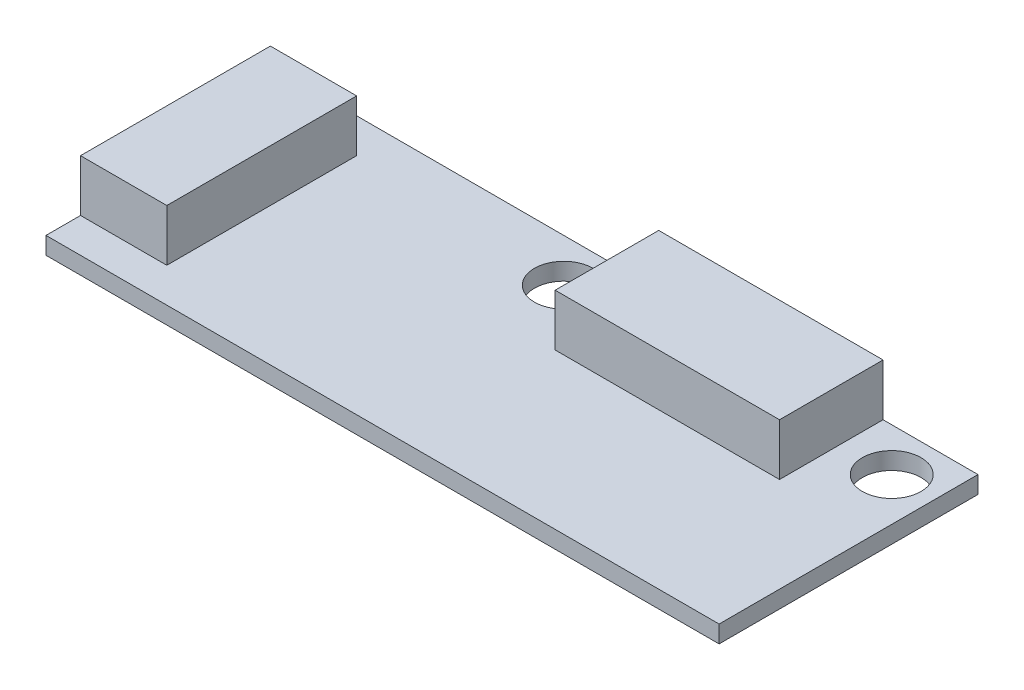
ISO-10303-21;
HEADER;
FILE_DESCRIPTION(('STEP AP214'),'2;1');
FILE_NAME('part.step','',(''),(''),'','','');
FILE_SCHEMA(('AUTOMOTIVE_DESIGN { 1 0 10303 214 1 1 1 1 }'));
ENDSEC;
DATA;
#1=APPLICATION_CONTEXT('core data for automotive mechanical design processes');
#2=APPLICATION_PROTOCOL_DEFINITION('international standard','automotive_design',2000,#1);
#3=PRODUCT_CONTEXT('',#1,'mechanical');
#4=PRODUCT('Part','Part','',(#3));
#5=PRODUCT_RELATED_PRODUCT_CATEGORY('part','',(#4));
#6=PRODUCT_DEFINITION_FORMATION('','',#4);
#7=PRODUCT_DEFINITION_CONTEXT('part definition',#1,'design');
#8=PRODUCT_DEFINITION('design','',#6,#7);
#9=PRODUCT_DEFINITION_SHAPE('','',#8);
#10=(LENGTH_UNIT() NAMED_UNIT(*) SI_UNIT(.MILLI.,.METRE.));
#11=(NAMED_UNIT(*) PLANE_ANGLE_UNIT() SI_UNIT($,.RADIAN.));
#12=(NAMED_UNIT(*) SI_UNIT($,.STERADIAN.) SOLID_ANGLE_UNIT());
#13=UNCERTAINTY_MEASURE_WITH_UNIT(LENGTH_MEASURE(1.E-05),#10,'distance_accuracy_value','');
#14=(GEOMETRIC_REPRESENTATION_CONTEXT(3) GLOBAL_UNCERTAINTY_ASSIGNED_CONTEXT((#13)) GLOBAL_UNIT_ASSIGNED_CONTEXT((#10,
#11,#12)) REPRESENTATION_CONTEXT('',''));
#15=CARTESIAN_POINT('',(0.,0.,0.));
#16=DIRECTION('',(0.,0.,1.));
#17=DIRECTION('',(1.,0.,0.));
#18=AXIS2_PLACEMENT_3D('',#15,#16,#17);
#19=CARTESIAN_POINT('',(0.,1.,0.));
#20=DIRECTION('',(0.,-1.,0.));
#21=DIRECTION('',(0.,0.,-1.));
#22=AXIS2_PLACEMENT_3D('',#19,#20,#21);
#23=PLANE('',#22);
#24=CARTESIAN_POINT('',(36.5,1.,-12.5));
#25=DIRECTION('',(0.,1.,0.));
#26=DIRECTION('',(0.,0.,1.));
#27=AXIS2_PLACEMENT_3D('',#24,#25,#26);
#28=CIRCLE('',#27,1.69999999999999);
#29=CARTESIAN_POINT('',(36.5,1.,-10.8));
#30=VERTEX_POINT('',#29);
#31=EDGE_CURVE('E179',#30,#30,#28,.T.);
#32=ORIENTED_EDGE('',*,*,#31,.F.);
#33=EDGE_LOOP('',(#32));
#34=FACE_BOUND('',#33,.T.);
#35=CARTESIAN_POINT('',(17.5,1.,-12.5));
#36=DIRECTION('',(0.,1.,0.));
#37=DIRECTION('',(0.,0.,1.));
#38=AXIS2_PLACEMENT_3D('',#35,#36,#37);
#39=CIRCLE('',#38,1.69999999999999);
#40=CARTESIAN_POINT('',(17.5,1.,-10.8));
#41=VERTEX_POINT('',#40);
#42=EDGE_CURVE('E185',#41,#41,#39,.T.);
#43=ORIENTED_EDGE('',*,*,#42,.F.);
#44=EDGE_LOOP('',(#43));
#45=FACE_BOUND('',#44,.T.);
#46=DIRECTION('',(1.,0.,0.));
#47=VECTOR('',#46,1.);
#48=CARTESIAN_POINT('',(0.,1.,-2.));
#49=LINE('',#48,#47);
#50=CARTESIAN_POINT('',(0.,1.,-2.));
#51=VERTEX_POINT('',#50);
#52=CARTESIAN_POINT('',(5.,1.,-2.));
#53=VERTEX_POINT('',#52);
#54=EDGE_CURVE('E238',#51,#53,#49,.T.);
#55=ORIENTED_EDGE('',*,*,#54,.F.);
#56=DIRECTION('',(0.,0.,1.));
#57=VECTOR('',#56,1.);
#58=CARTESIAN_POINT('',(0.,1.,0.));
#59=LINE('',#58,#57);
#60=CARTESIAN_POINT('',(0.,1.,0.));
#61=VERTEX_POINT('',#60);
#62=EDGE_CURVE('E143',#51,#61,#59,.T.);
#63=ORIENTED_EDGE('',*,*,#62,.T.);
#64=DIRECTION('',(1.,0.,0.));
#65=VECTOR('',#64,1.);
#66=CARTESIAN_POINT('',(0.,1.,0.));
#67=LINE('',#66,#65);
#68=CARTESIAN_POINT('',(39.,1.,0.));
#69=VERTEX_POINT('',#68);
#70=EDGE_CURVE('E194',#61,#69,#67,.T.);
#71=ORIENTED_EDGE('',*,*,#70,.T.);
#72=DIRECTION('',(0.,0.,-1.));
#73=VECTOR('',#72,1.);
#74=CARTESIAN_POINT('',(39.,1.,0.));
#75=LINE('',#74,#73);
#76=CARTESIAN_POINT('',(39.,1.,-15.));
#77=VERTEX_POINT('',#76);
#78=EDGE_CURVE('E196',#69,#77,#75,.T.);
#79=ORIENTED_EDGE('',*,*,#78,.T.);
#80=DIRECTION('',(-1.,0.,0.));
#81=VECTOR('',#80,1.);
#82=CARTESIAN_POINT('',(0.,1.,-15.));
#83=LINE('',#82,#81);
#84=CARTESIAN_POINT('',(33.5,1.,-15.));
#85=VERTEX_POINT('',#84);
#86=EDGE_CURVE('E199',#77,#85,#83,.T.);
#87=ORIENTED_EDGE('',*,*,#86,.T.);
#88=DIRECTION('',(0.,0.,-1.));
#89=VECTOR('',#88,1.);
#90=CARTESIAN_POINT('',(33.5,1.,-15.));
#91=LINE('',#90,#89);
#92=CARTESIAN_POINT('',(33.5,1.,-9.));
#93=VERTEX_POINT('',#92);
#94=EDGE_CURVE('E157',#93,#85,#91,.T.);
#95=ORIENTED_EDGE('',*,*,#94,.F.);
#96=DIRECTION('',(1.,0.,0.));
#97=VECTOR('',#96,1.);
#98=CARTESIAN_POINT('',(20.5,1.,-9.));
#99=LINE('',#98,#97);
#100=CARTESIAN_POINT('',(20.5,1.,-9.));
#101=VERTEX_POINT('',#100);
#102=EDGE_CURVE('E147',#101,#93,#99,.T.);
#103=ORIENTED_EDGE('',*,*,#102,.F.);
#104=DIRECTION('',(0.,0.,1.));
#105=VECTOR('',#104,1.);
#106=CARTESIAN_POINT('',(20.5,1.,-15.));
#107=LINE('',#106,#105);
#108=CARTESIAN_POINT('',(20.5,1.,-15.));
#109=VERTEX_POINT('',#108);
#110=EDGE_CURVE('E144',#109,#101,#107,.T.);
#111=ORIENTED_EDGE('',*,*,#110,.F.);
#112=CARTESIAN_POINT('',(0.,1.,-15.));
#113=VERTEX_POINT('',#112);
#114=EDGE_CURVE('E198',#109,#113,#83,.T.);
#115=ORIENTED_EDGE('',*,*,#114,.T.);
#116=CARTESIAN_POINT('',(0.,1.,-13.));
#117=VERTEX_POINT('',#116);
#118=EDGE_CURVE('E192',#113,#117,#59,.T.);
#119=ORIENTED_EDGE('',*,*,#118,.T.);
#120=DIRECTION('',(-1.,0.,0.));
#121=VECTOR('',#120,1.);
#122=CARTESIAN_POINT('',(0.,1.,-13.));
#123=LINE('',#122,#121);
#124=CARTESIAN_POINT('',(5.,1.,-13.));
#125=VERTEX_POINT('',#124);
#126=EDGE_CURVE('E53',#125,#117,#123,.T.);
#127=ORIENTED_EDGE('',*,*,#126,.F.);
#128=DIRECTION('',(0.,0.,-1.));
#129=VECTOR('',#128,1.);
#130=CARTESIAN_POINT('',(5.,1.,-13.));
#131=LINE('',#130,#129);
#132=EDGE_CURVE('E48',#53,#125,#131,.T.);
#133=ORIENTED_EDGE('',*,*,#132,.F.);
#134=EDGE_LOOP('',(#55,#63,#71,#79,#87,#95,#103,#111,#115,#119,#127,#133));
#135=FACE_BOUND('',#134,.T.);
#136=ADVANCED_FACE('F33',(#34,#45,#135),#23,.F.);
#137=CARTESIAN_POINT('',(0.,1.,0.));
#138=DIRECTION('',(1.,0.,0.));
#139=DIRECTION('',(0.,0.,-1.));
#140=AXIS2_PLACEMENT_3D('',#137,#138,#139);
#141=PLANE('',#140);
#142=DIRECTION('',(0.,0.,1.));
#143=VECTOR('',#142,1.);
#144=CARTESIAN_POINT('',(0.,0.,0.));
#145=LINE('',#144,#143);
#146=CARTESIAN_POINT('',(0.,0.,-15.));
#147=VERTEX_POINT('',#146);
#148=CARTESIAN_POINT('',(0.,0.,0.));
#149=VERTEX_POINT('',#148);
#150=EDGE_CURVE('E191',#147,#149,#145,.T.);
#151=ORIENTED_EDGE('',*,*,#150,.T.);
#152=DIRECTION('',(0.,-1.,0.));
#153=VECTOR('',#152,1.);
#154=CARTESIAN_POINT('',(0.,1.,0.));
#155=LINE('',#154,#153);
#156=EDGE_CURVE('E11',#61,#149,#155,.T.);
#157=ORIENTED_EDGE('',*,*,#156,.F.);
#158=ORIENTED_EDGE('',*,*,#62,.F.);
#159=DIRECTION('',(0.,-1.,0.));
#160=VECTOR('',#159,1.);
#161=CARTESIAN_POINT('',(0.,4.,-2.));
#162=LINE('',#161,#160);
#163=CARTESIAN_POINT('',(0.,4.,-2.));
#164=VERTEX_POINT('',#163);
#165=EDGE_CURVE('E125',#164,#51,#162,.T.);
#166=ORIENTED_EDGE('',*,*,#165,.F.);
#167=DIRECTION('',(0.,0.,1.));
#168=VECTOR('',#167,1.);
#169=CARTESIAN_POINT('',(0.,4.,-13.));
#170=LINE('',#169,#168);
#171=CARTESIAN_POINT('',(0.,4.,-13.));
#172=VERTEX_POINT('',#171);
#173=EDGE_CURVE('E131',#172,#164,#170,.T.);
#174=ORIENTED_EDGE('',*,*,#173,.F.);
#175=DIRECTION('',(0.,-1.,0.));
#176=VECTOR('',#175,1.);
#177=CARTESIAN_POINT('',(0.,4.,-13.));
#178=LINE('',#177,#176);
#179=EDGE_CURVE('E232',#172,#117,#178,.T.);
#180=ORIENTED_EDGE('',*,*,#179,.T.);
#181=ORIENTED_EDGE('',*,*,#118,.F.);
#182=DIRECTION('',(0.,-1.,0.));
#183=VECTOR('',#182,1.);
#184=CARTESIAN_POINT('',(0.,1.,-15.));
#185=LINE('',#184,#183);
#186=EDGE_CURVE('E201',#113,#147,#185,.T.);
#187=ORIENTED_EDGE('',*,*,#186,.T.);
#188=EDGE_LOOP('',(#151,#157,#158,#166,#174,#180,#181,#187));
#189=FACE_BOUND('',#188,.T.);
#190=ADVANCED_FACE('F35',(#189),#141,.F.);
#191=CARTESIAN_POINT('',(0.,1.,0.));
#192=DIRECTION('',(0.,0.,-1.));
#193=DIRECTION('',(-1.,0.,0.));
#194=AXIS2_PLACEMENT_3D('',#191,#192,#193);
#195=PLANE('',#194);
#196=DIRECTION('',(1.,0.,0.));
#197=VECTOR('',#196,1.);
#198=CARTESIAN_POINT('',(0.,0.,0.));
#199=LINE('',#198,#197);
#200=CARTESIAN_POINT('',(39.,0.,0.));
#201=VERTEX_POINT('',#200);
#202=EDGE_CURVE('E203',#149,#201,#199,.T.);
#203=ORIENTED_EDGE('',*,*,#202,.T.);
#204=DIRECTION('',(0.,-1.,0.));
#205=VECTOR('',#204,1.);
#206=CARTESIAN_POINT('',(39.,1.,0.));
#207=LINE('',#206,#205);
#208=EDGE_CURVE('E41',#69,#201,#207,.T.);
#209=ORIENTED_EDGE('',*,*,#208,.F.);
#210=ORIENTED_EDGE('',*,*,#70,.F.);
#211=ORIENTED_EDGE('',*,*,#156,.T.);
#212=EDGE_LOOP('',(#203,#209,#210,#211));
#213=FACE_BOUND('',#212,.T.);
#214=ADVANCED_FACE('F261',(#213),#195,.F.);
#215=CARTESIAN_POINT('',(39.,1.,0.));
#216=DIRECTION('',(-1.,0.,0.));
#217=DIRECTION('',(0.,0.,1.));
#218=AXIS2_PLACEMENT_3D('',#215,#216,#217);
#219=PLANE('',#218);
#220=DIRECTION('',(0.,0.,-1.));
#221=VECTOR('',#220,1.);
#222=CARTESIAN_POINT('',(39.,0.,0.));
#223=LINE('',#222,#221);
#224=CARTESIAN_POINT('',(39.,0.,-15.));
#225=VERTEX_POINT('',#224);
#226=EDGE_CURVE('E205',#201,#225,#223,.T.);
#227=ORIENTED_EDGE('',*,*,#226,.T.);
#228=DIRECTION('',(0.,-1.,0.));
#229=VECTOR('',#228,1.);
#230=CARTESIAN_POINT('',(39.,1.,-15.));
#231=LINE('',#230,#229);
#232=EDGE_CURVE('E211',#77,#225,#231,.T.);
#233=ORIENTED_EDGE('',*,*,#232,.F.);
#234=ORIENTED_EDGE('',*,*,#78,.F.);
#235=ORIENTED_EDGE('',*,*,#208,.T.);
#236=EDGE_LOOP('',(#227,#233,#234,#235));
#237=FACE_BOUND('',#236,.T.);
#238=ADVANCED_FACE('F218',(#237),#219,.F.);
#239=CARTESIAN_POINT('',(0.,1.,-15.));
#240=DIRECTION('',(0.,0.,1.));
#241=DIRECTION('',(1.,0.,0.));
#242=AXIS2_PLACEMENT_3D('',#239,#240,#241);
#243=PLANE('',#242);
#244=DIRECTION('',(-1.,0.,0.));
#245=VECTOR('',#244,1.);
#246=CARTESIAN_POINT('',(0.,0.,-15.));
#247=LINE('',#246,#245);
#248=EDGE_CURVE('E207',#225,#147,#247,.T.);
#249=ORIENTED_EDGE('',*,*,#248,.T.);
#250=ORIENTED_EDGE('',*,*,#186,.F.);
#251=ORIENTED_EDGE('',*,*,#114,.F.);
#252=DIRECTION('',(0.,-1.,0.));
#253=VECTOR('',#252,1.);
#254=CARTESIAN_POINT('',(20.5,4.,-15.));
#255=LINE('',#254,#253);
#256=CARTESIAN_POINT('',(20.5,4.,-15.));
#257=VERTEX_POINT('',#256);
#258=EDGE_CURVE('E162',#257,#109,#255,.T.);
#259=ORIENTED_EDGE('',*,*,#258,.F.);
#260=DIRECTION('',(-1.,0.,0.));
#261=VECTOR('',#260,1.);
#262=CARTESIAN_POINT('',(20.5,4.,-15.));
#263=LINE('',#262,#261);
#264=CARTESIAN_POINT('',(33.5,4.,-15.));
#265=VERTEX_POINT('',#264);
#266=EDGE_CURVE('E161',#265,#257,#263,.T.);
#267=ORIENTED_EDGE('',*,*,#266,.F.);
#268=DIRECTION('',(0.,-1.,0.));
#269=VECTOR('',#268,1.);
#270=CARTESIAN_POINT('',(33.5,4.,-15.));
#271=LINE('',#270,#269);
#272=EDGE_CURVE('E170',#265,#85,#271,.T.);
#273=ORIENTED_EDGE('',*,*,#272,.T.);
#274=ORIENTED_EDGE('',*,*,#86,.F.);
#275=ORIENTED_EDGE('',*,*,#232,.T.);
#276=EDGE_LOOP('',(#249,#250,#251,#259,#267,#273,#274,#275));
#277=FACE_BOUND('',#276,.T.);
#278=ADVANCED_FACE('F228',(#277),#243,.F.);
#279=CARTESIAN_POINT('',(0.,0.,0.));
#280=DIRECTION('',(0.,-1.,0.));
#281=DIRECTION('',(0.,0.,-1.));
#282=AXIS2_PLACEMENT_3D('',#279,#280,#281);
#283=PLANE('',#282);
#284=CARTESIAN_POINT('',(36.5,0.,-12.5));
#285=DIRECTION('',(0.,1.,0.));
#286=DIRECTION('',(0.,0.,1.));
#287=AXIS2_PLACEMENT_3D('',#284,#285,#286);
#288=CIRCLE('',#287,1.7);
#289=CARTESIAN_POINT('',(36.5,0.,-10.8));
#290=VERTEX_POINT('',#289);
#291=EDGE_CURVE('E182',#290,#290,#288,.T.);
#292=ORIENTED_EDGE('',*,*,#291,.T.);
#293=EDGE_LOOP('',(#292));
#294=FACE_BOUND('',#293,.T.);
#295=CARTESIAN_POINT('',(17.5,0.,-12.5));
#296=DIRECTION('',(0.,1.,0.));
#297=DIRECTION('',(0.,0.,1.));
#298=AXIS2_PLACEMENT_3D('',#295,#296,#297);
#299=CIRCLE('',#298,1.7);
#300=CARTESIAN_POINT('',(17.5,0.,-10.8));
#301=VERTEX_POINT('',#300);
#302=EDGE_CURVE('E188',#301,#301,#299,.T.);
#303=ORIENTED_EDGE('',*,*,#302,.T.);
#304=EDGE_LOOP('',(#303));
#305=FACE_BOUND('',#304,.T.);
#306=ORIENTED_EDGE('',*,*,#150,.F.);
#307=ORIENTED_EDGE('',*,*,#248,.F.);
#308=ORIENTED_EDGE('',*,*,#226,.F.);
#309=ORIENTED_EDGE('',*,*,#202,.F.);
#310=EDGE_LOOP('',(#306,#307,#308,#309));
#311=FACE_BOUND('',#310,.T.);
#312=ADVANCED_FACE('F225',(#294,#305,#311),#283,.T.);
#313=CARTESIAN_POINT('',(17.5,1.,-12.5));
#314=DIRECTION('',(0.,1.,0.));
#315=DIRECTION('',(0.,0.,1.));
#316=AXIS2_PLACEMENT_3D('',#313,#314,#315);
#317=CYLINDRICAL_SURFACE('',#316,1.69999999999999);
#318=ORIENTED_EDGE('',*,*,#302,.F.);
#319=EDGE_LOOP('',(#318));
#320=FACE_BOUND('',#319,.T.);
#321=ORIENTED_EDGE('',*,*,#42,.T.);
#322=EDGE_LOOP('',(#321));
#323=FACE_BOUND('',#322,.T.);
#324=ADVANCED_FACE('F266',(#320,#323),#317,.F.);
#325=CARTESIAN_POINT('',(36.5,1.,-12.5));
#326=DIRECTION('',(0.,1.,0.));
#327=DIRECTION('',(0.,0.,1.));
#328=AXIS2_PLACEMENT_3D('',#325,#326,#327);
#329=CYLINDRICAL_SURFACE('',#328,1.69999999999999);
#330=ORIENTED_EDGE('',*,*,#291,.F.);
#331=EDGE_LOOP('',(#330));
#332=FACE_BOUND('',#331,.T.);
#333=ORIENTED_EDGE('',*,*,#31,.T.);
#334=EDGE_LOOP('',(#333));
#335=FACE_BOUND('',#334,.T.);
#336=ADVANCED_FACE('F301',(#332,#335),#329,.F.);
#337=CARTESIAN_POINT('',(20.5,4.,-15.));
#338=DIRECTION('',(1.,0.,0.));
#339=DIRECTION('',(0.,0.,-1.));
#340=AXIS2_PLACEMENT_3D('',#337,#338,#339);
#341=PLANE('',#340);
#342=ORIENTED_EDGE('',*,*,#110,.T.);
#343=DIRECTION('',(0.,-1.,0.));
#344=VECTOR('',#343,1.);
#345=CARTESIAN_POINT('',(20.5,4.,-9.));
#346=LINE('',#345,#344);
#347=CARTESIAN_POINT('',(20.5,4.,-9.));
#348=VERTEX_POINT('',#347);
#349=EDGE_CURVE('E176',#348,#101,#346,.T.);
#350=ORIENTED_EDGE('',*,*,#349,.F.);
#351=DIRECTION('',(0.,0.,1.));
#352=VECTOR('',#351,1.);
#353=CARTESIAN_POINT('',(20.5,4.,-15.));
#354=LINE('',#353,#352);
#355=EDGE_CURVE('E153',#257,#348,#354,.T.);
#356=ORIENTED_EDGE('',*,*,#355,.F.);
#357=ORIENTED_EDGE('',*,*,#258,.T.);
#358=EDGE_LOOP('',(#342,#350,#356,#357));
#359=FACE_BOUND('',#358,.T.);
#360=ADVANCED_FACE('F289',(#359),#341,.F.);
#361=CARTESIAN_POINT('',(20.5,4.,-9.));
#362=DIRECTION('',(0.,0.,-1.));
#363=DIRECTION('',(-1.,0.,0.));
#364=AXIS2_PLACEMENT_3D('',#361,#362,#363);
#365=PLANE('',#364);
#366=ORIENTED_EDGE('',*,*,#102,.T.);
#367=DIRECTION('',(0.,-1.,0.));
#368=VECTOR('',#367,1.);
#369=CARTESIAN_POINT('',(33.5,4.,-9.));
#370=LINE('',#369,#368);
#371=CARTESIAN_POINT('',(33.5,4.,-9.));
#372=VERTEX_POINT('',#371);
#373=EDGE_CURVE('E173',#372,#93,#370,.T.);
#374=ORIENTED_EDGE('',*,*,#373,.F.);
#375=DIRECTION('',(1.,0.,0.));
#376=VECTOR('',#375,1.);
#377=CARTESIAN_POINT('',(20.5,4.,-9.));
#378=LINE('',#377,#376);
#379=EDGE_CURVE('E156',#348,#372,#378,.T.);
#380=ORIENTED_EDGE('',*,*,#379,.F.);
#381=ORIENTED_EDGE('',*,*,#349,.T.);
#382=EDGE_LOOP('',(#366,#374,#380,#381));
#383=FACE_BOUND('',#382,.T.);
#384=ADVANCED_FACE('F285',(#383),#365,.F.);
#385=CARTESIAN_POINT('',(33.5,4.,-15.));
#386=DIRECTION('',(-1.,0.,0.));
#387=DIRECTION('',(0.,0.,1.));
#388=AXIS2_PLACEMENT_3D('',#385,#386,#387);
#389=PLANE('',#388);
#390=ORIENTED_EDGE('',*,*,#94,.T.);
#391=ORIENTED_EDGE('',*,*,#272,.F.);
#392=DIRECTION('',(0.,0.,-1.));
#393=VECTOR('',#392,1.);
#394=CARTESIAN_POINT('',(33.5,4.,-15.));
#395=LINE('',#394,#393);
#396=EDGE_CURVE('E159',#372,#265,#395,.T.);
#397=ORIENTED_EDGE('',*,*,#396,.F.);
#398=ORIENTED_EDGE('',*,*,#373,.T.);
#399=EDGE_LOOP('',(#390,#391,#397,#398));
#400=FACE_BOUND('',#399,.T.);
#401=ADVANCED_FACE('F282',(#400),#389,.F.);
#402=CARTESIAN_POINT('',(0.,4.,0.));
#403=DIRECTION('',(0.,1.,0.));
#404=DIRECTION('',(0.,0.,1.));
#405=AXIS2_PLACEMENT_3D('',#402,#403,#404);
#406=PLANE('',#405);
#407=ORIENTED_EDGE('',*,*,#355,.T.);
#408=ORIENTED_EDGE('',*,*,#379,.T.);
#409=ORIENTED_EDGE('',*,*,#396,.T.);
#410=ORIENTED_EDGE('',*,*,#266,.T.);
#411=EDGE_LOOP('',(#407,#408,#409,#410));
#412=FACE_BOUND('',#411,.T.);
#413=ADVANCED_FACE('F253',(#412),#406,.T.);
#414=CARTESIAN_POINT('',(0.,4.,-2.));
#415=DIRECTION('',(0.,0.,-1.));
#416=DIRECTION('',(-1.,0.,0.));
#417=AXIS2_PLACEMENT_3D('',#414,#415,#416);
#418=PLANE('',#417);
#419=ORIENTED_EDGE('',*,*,#54,.T.);
#420=DIRECTION('',(0.,-1.,0.));
#421=VECTOR('',#420,1.);
#422=CARTESIAN_POINT('',(5.,4.,-2.));
#423=LINE('',#422,#421);
#424=CARTESIAN_POINT('',(5.,4.,-2.));
#425=VERTEX_POINT('',#424);
#426=EDGE_CURVE('E127',#425,#53,#423,.T.);
#427=ORIENTED_EDGE('',*,*,#426,.F.);
#428=DIRECTION('',(1.,0.,0.));
#429=VECTOR('',#428,1.);
#430=CARTESIAN_POINT('',(0.,4.,-2.));
#431=LINE('',#430,#429);
#432=EDGE_CURVE('E121',#164,#425,#431,.T.);
#433=ORIENTED_EDGE('',*,*,#432,.F.);
#434=ORIENTED_EDGE('',*,*,#165,.T.);
#435=EDGE_LOOP('',(#419,#427,#433,#434));
#436=FACE_BOUND('',#435,.T.);
#437=ADVANCED_FACE('F123',(#436),#418,.F.);
#438=CARTESIAN_POINT('',(5.,4.,-13.));
#439=DIRECTION('',(-1.,0.,0.));
#440=DIRECTION('',(0.,0.,1.));
#441=AXIS2_PLACEMENT_3D('',#438,#439,#440);
#442=PLANE('',#441);
#443=ORIENTED_EDGE('',*,*,#132,.T.);
#444=DIRECTION('',(0.,-1.,0.));
#445=VECTOR('',#444,1.);
#446=CARTESIAN_POINT('',(5.,4.,-13.));
#447=LINE('',#446,#445);
#448=CARTESIAN_POINT('',(5.,4.,-13.));
#449=VERTEX_POINT('',#448);
#450=EDGE_CURVE('E149',#449,#125,#447,.T.);
#451=ORIENTED_EDGE('',*,*,#450,.F.);
#452=DIRECTION('',(0.,0.,-1.));
#453=VECTOR('',#452,1.);
#454=CARTESIAN_POINT('',(5.,4.,-13.));
#455=LINE('',#454,#453);
#456=EDGE_CURVE('E130',#425,#449,#455,.T.);
#457=ORIENTED_EDGE('',*,*,#456,.F.);
#458=ORIENTED_EDGE('',*,*,#426,.T.);
#459=EDGE_LOOP('',(#443,#451,#457,#458));
#460=FACE_BOUND('',#459,.T.);
#461=ADVANCED_FACE('F245',(#460),#442,.F.);
#462=CARTESIAN_POINT('',(0.,4.,-13.));
#463=DIRECTION('',(0.,0.,1.));
#464=DIRECTION('',(1.,0.,0.));
#465=AXIS2_PLACEMENT_3D('',#462,#463,#464);
#466=PLANE('',#465);
#467=ORIENTED_EDGE('',*,*,#126,.T.);
#468=ORIENTED_EDGE('',*,*,#179,.F.);
#469=DIRECTION('',(-1.,0.,0.));
#470=VECTOR('',#469,1.);
#471=CARTESIAN_POINT('',(0.,4.,-13.));
#472=LINE('',#471,#470);
#473=EDGE_CURVE('E136',#449,#172,#472,.T.);
#474=ORIENTED_EDGE('',*,*,#473,.F.);
#475=ORIENTED_EDGE('',*,*,#450,.T.);
#476=EDGE_LOOP('',(#467,#468,#474,#475));
#477=FACE_BOUND('',#476,.T.);
#478=ADVANCED_FACE('F235',(#477),#466,.F.);
#479=CARTESIAN_POINT('',(0.,4.,0.));
#480=DIRECTION('',(0.,1.,0.));
#481=DIRECTION('',(0.,0.,1.));
#482=AXIS2_PLACEMENT_3D('',#479,#480,#481);
#483=PLANE('',#482);
#484=ORIENTED_EDGE('',*,*,#173,.T.);
#485=ORIENTED_EDGE('',*,*,#432,.T.);
#486=ORIENTED_EDGE('',*,*,#456,.T.);
#487=ORIENTED_EDGE('',*,*,#473,.T.);
#488=EDGE_LOOP('',(#484,#485,#486,#487));
#489=FACE_BOUND('',#488,.T.);
#490=ADVANCED_FACE('F134',(#489),#483,.T.);
#491=CLOSED_SHELL('',(#136,#190,#214,#238,#278,#312,#324,#336,#360,#384,#401,#413,#437,#461,
#478,#490));
#492=MANIFOLD_SOLID_BREP('B2',#491);
#493=ADVANCED_BREP_SHAPE_REPRESENTATION('',(#18,#492),#14);
#494=SHAPE_DEFINITION_REPRESENTATION(#9,#493);
ENDSEC;
END-ISO-10303-21;
